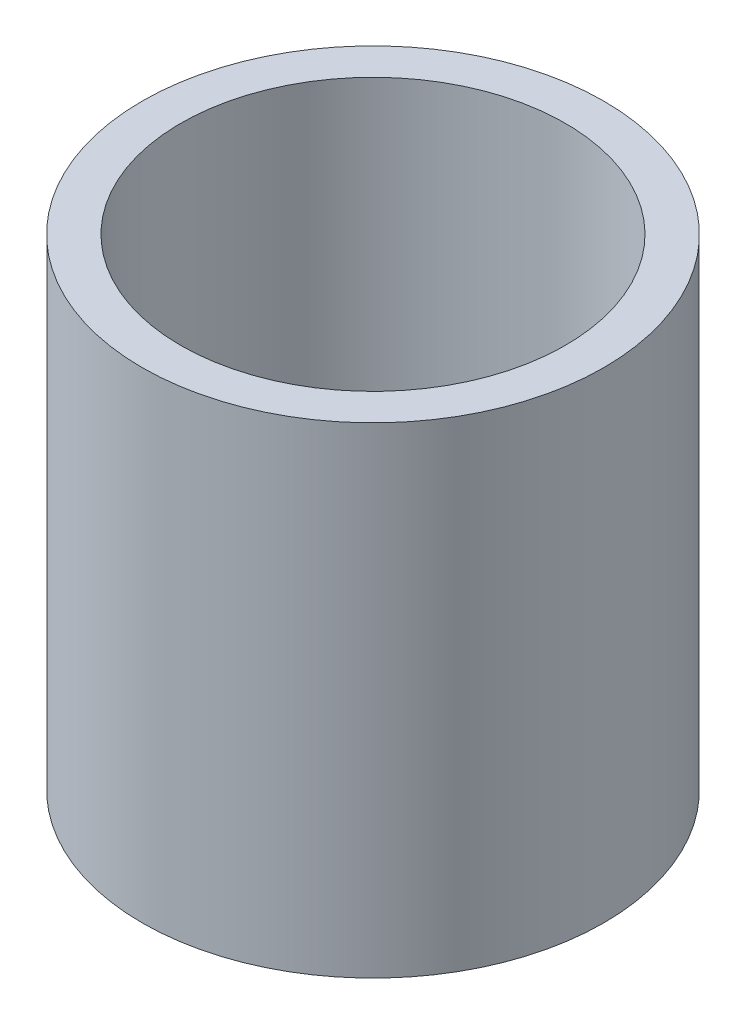
ISO-10303-21;
HEADER;
FILE_DESCRIPTION(('STEP AP214'),'2;1');
FILE_NAME('part.step','',(''),(''),'','','');
FILE_SCHEMA(('AUTOMOTIVE_DESIGN { 1 0 10303 214 1 1 1 1 }'));
ENDSEC;
DATA;
#1=APPLICATION_CONTEXT('core data for automotive mechanical design processes');
#2=APPLICATION_PROTOCOL_DEFINITION('international standard','automotive_design',2000,#1);
#3=PRODUCT_CONTEXT('',#1,'mechanical');
#4=PRODUCT('Part','Part','',(#3));
#5=PRODUCT_RELATED_PRODUCT_CATEGORY('part','',(#4));
#6=PRODUCT_DEFINITION_FORMATION('','',#4);
#7=PRODUCT_DEFINITION_CONTEXT('part definition',#1,'design');
#8=PRODUCT_DEFINITION('design','',#6,#7);
#9=PRODUCT_DEFINITION_SHAPE('','',#8);
#10=(LENGTH_UNIT() NAMED_UNIT(*) SI_UNIT(.MILLI.,.METRE.));
#11=(NAMED_UNIT(*) PLANE_ANGLE_UNIT() SI_UNIT($,.RADIAN.));
#12=(NAMED_UNIT(*) SI_UNIT($,.STERADIAN.) SOLID_ANGLE_UNIT());
#13=UNCERTAINTY_MEASURE_WITH_UNIT(LENGTH_MEASURE(1.E-05),#10,'distance_accuracy_value','');
#14=(GEOMETRIC_REPRESENTATION_CONTEXT(3) GLOBAL_UNCERTAINTY_ASSIGNED_CONTEXT((#13)) GLOBAL_UNIT_ASSIGNED_CONTEXT((#10,
#11,#12)) REPRESENTATION_CONTEXT('',''));
#15=CARTESIAN_POINT('',(0.,0.,0.));
#16=DIRECTION('',(0.,0.,1.));
#17=DIRECTION('',(1.,0.,0.));
#18=AXIS2_PLACEMENT_3D('',#15,#16,#17);
#19=CARTESIAN_POINT('',(0.,25.,0.));
#20=DIRECTION('',(0.,1.,0.));
#21=DIRECTION('',(0.,0.,1.));
#22=AXIS2_PLACEMENT_3D('',#19,#20,#21);
#23=PLANE('',#22);
#24=CARTESIAN_POINT('',(0.,25.,0.));
#25=DIRECTION('',(0.,1.,0.));
#26=DIRECTION('',(0.,0.,1.));
#27=AXIS2_PLACEMENT_3D('',#24,#25,#26);
#28=CIRCLE('',#27,12.);
#29=CARTESIAN_POINT('',(0.,25.,12.));
#30=VERTEX_POINT('',#29);
#31=EDGE_CURVE('E10',#30,#30,#28,.T.);
#32=ORIENTED_EDGE('',*,*,#31,.T.);
#33=EDGE_LOOP('',(#32));
#34=FACE_BOUND('',#33,.T.);
#35=CARTESIAN_POINT('',(0.,25.,0.));
#36=DIRECTION('',(0.,1.,0.));
#37=DIRECTION('',(0.,0.,1.));
#38=AXIS2_PLACEMENT_3D('',#35,#36,#37);
#39=CIRCLE('',#38,10.);
#40=CARTESIAN_POINT('',(0.,25.,10.));
#41=VERTEX_POINT('',#40);
#42=EDGE_CURVE('E50',#41,#41,#39,.T.);
#43=ORIENTED_EDGE('',*,*,#42,.F.);
#44=EDGE_LOOP('',(#43));
#45=FACE_BOUND('',#44,.T.);
#46=ADVANCED_FACE('F37',(#34,#45),#23,.T.);
#47=CARTESIAN_POINT('',(0.,0.,0.));
#48=DIRECTION('',(0.,1.,0.));
#49=DIRECTION('',(0.,0.,1.));
#50=AXIS2_PLACEMENT_3D('',#47,#48,#49);
#51=PLANE('',#50);
#52=CARTESIAN_POINT('',(0.,0.,0.));
#53=DIRECTION('',(0.,1.,0.));
#54=DIRECTION('',(0.,0.,1.));
#55=AXIS2_PLACEMENT_3D('',#52,#53,#54);
#56=CIRCLE('',#55,12.);
#57=CARTESIAN_POINT('',(0.,0.,12.));
#58=VERTEX_POINT('',#57);
#59=EDGE_CURVE('E41',#58,#58,#56,.T.);
#60=ORIENTED_EDGE('',*,*,#59,.F.);
#61=EDGE_LOOP('',(#60));
#62=FACE_BOUND('',#61,.T.);
#63=CARTESIAN_POINT('',(0.,0.,0.));
#64=DIRECTION('',(0.,1.,0.));
#65=DIRECTION('',(0.,0.,1.));
#66=AXIS2_PLACEMENT_3D('',#63,#64,#65);
#67=CIRCLE('',#66,10.);
#68=CARTESIAN_POINT('',(0.,0.,10.));
#69=VERTEX_POINT('',#68);
#70=EDGE_CURVE('E52',#69,#69,#67,.T.);
#71=ORIENTED_EDGE('',*,*,#70,.T.);
#72=EDGE_LOOP('',(#71));
#73=FACE_BOUND('',#72,.T.);
#74=ADVANCED_FACE('F64',(#62,#73),#51,.F.);
#75=CARTESIAN_POINT('',(0.,25.,0.));
#76=DIRECTION('',(0.,-1.,0.));
#77=DIRECTION('',(0.,0.,-1.));
#78=AXIS2_PLACEMENT_3D('',#75,#76,#77);
#79=CYLINDRICAL_SURFACE('',#78,12.);
#80=ORIENTED_EDGE('',*,*,#31,.F.);
#81=EDGE_LOOP('',(#80));
#82=FACE_BOUND('',#81,.T.);
#83=ORIENTED_EDGE('',*,*,#59,.T.);
#84=EDGE_LOOP('',(#83));
#85=FACE_BOUND('',#84,.T.);
#86=ADVANCED_FACE('F39',(#82,#85),#79,.T.);
#87=CARTESIAN_POINT('',(0.,25.,0.));
#88=DIRECTION('',(0.,-1.,0.));
#89=DIRECTION('',(0.,0.,-1.));
#90=AXIS2_PLACEMENT_3D('',#87,#88,#89);
#91=CYLINDRICAL_SURFACE('',#90,10.);
#92=ORIENTED_EDGE('',*,*,#42,.T.);
#93=EDGE_LOOP('',(#92));
#94=FACE_BOUND('',#93,.T.);
#95=ORIENTED_EDGE('',*,*,#70,.F.);
#96=EDGE_LOOP('',(#95));
#97=FACE_BOUND('',#96,.T.);
#98=ADVANCED_FACE('F60',(#94,#97),#91,.F.);
#99=CLOSED_SHELL('',(#46,#74,#86,#98));
#100=MANIFOLD_SOLID_BREP('B2',#99);
#101=ADVANCED_BREP_SHAPE_REPRESENTATION('',(#18,#100),#14);
#102=SHAPE_DEFINITION_REPRESENTATION(#9,#101);
ENDSEC;
END-ISO-10303-21;
